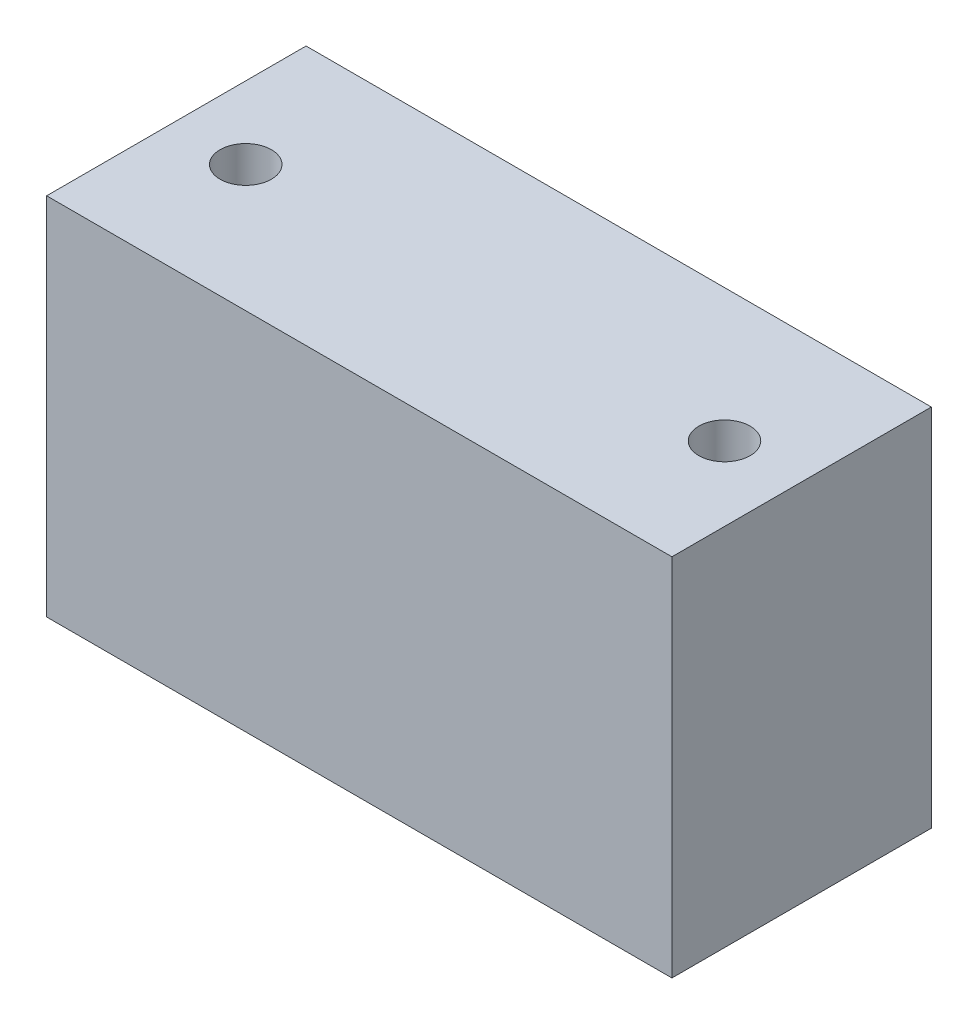
ISO-10303-21;
HEADER;
FILE_DESCRIPTION(('STEP AP214'),'2;1');
FILE_NAME('part.step','',(''),(''),'','','');
FILE_SCHEMA(('AUTOMOTIVE_DESIGN { 1 0 10303 214 1 1 1 1 }'));
ENDSEC;
DATA;
#1=APPLICATION_CONTEXT('core data for automotive mechanical design processes');
#2=APPLICATION_PROTOCOL_DEFINITION('international standard','automotive_design',2000,#1);
#3=PRODUCT_CONTEXT('',#1,'mechanical');
#4=PRODUCT('Part','Part','',(#3));
#5=PRODUCT_RELATED_PRODUCT_CATEGORY('part','',(#4));
#6=PRODUCT_DEFINITION_FORMATION('','',#4);
#7=PRODUCT_DEFINITION_CONTEXT('part definition',#1,'design');
#8=PRODUCT_DEFINITION('design','',#6,#7);
#9=PRODUCT_DEFINITION_SHAPE('','',#8);
#10=(LENGTH_UNIT() NAMED_UNIT(*) SI_UNIT(.MILLI.,.METRE.));
#11=(NAMED_UNIT(*) PLANE_ANGLE_UNIT() SI_UNIT($,.RADIAN.));
#12=(NAMED_UNIT(*) SI_UNIT($,.STERADIAN.) SOLID_ANGLE_UNIT());
#13=UNCERTAINTY_MEASURE_WITH_UNIT(LENGTH_MEASURE(1.E-05),#10,'distance_accuracy_value','');
#14=(GEOMETRIC_REPRESENTATION_CONTEXT(3) GLOBAL_UNCERTAINTY_ASSIGNED_CONTEXT((#13)) GLOBAL_UNIT_ASSIGNED_CONTEXT((#10,
#11,#12)) REPRESENTATION_CONTEXT('',''));
#15=CARTESIAN_POINT('',(0.,0.,0.));
#16=DIRECTION('',(0.,0.,1.));
#17=DIRECTION('',(1.,0.,0.));
#18=AXIS2_PLACEMENT_3D('',#15,#16,#17);
#19=CARTESIAN_POINT('',(17.4953052909621,32.,3.35378802988228));
#20=DIRECTION('',(1.,0.,0.));
#21=DIRECTION('',(0.,0.,-1.));
#22=AXIS2_PLACEMENT_3D('',#19,#20,#21);
#23=PLANE('',#22);
#24=DIRECTION('',(0.,0.,1.));
#25=VECTOR('',#24,1.);
#26=CARTESIAN_POINT('',(17.4953052909621,0.,3.35378802988228));
#27=LINE('',#26,#25);
#28=CARTESIAN_POINT('',(17.4953052909621,0.,-19.4050297637767));
#29=VERTEX_POINT('',#28);
#30=CARTESIAN_POINT('',(17.4953052909621,0.,3.35378802988228));
#31=VERTEX_POINT('',#30);
#32=EDGE_CURVE('E100',#29,#31,#27,.T.);
#33=ORIENTED_EDGE('',*,*,#32,.T.);
#34=DIRECTION('',(0.,-1.,0.));
#35=VECTOR('',#34,1.);
#36=CARTESIAN_POINT('',(17.4953052909621,32.,3.35378802988228));
#37=LINE('',#36,#35);
#38=CARTESIAN_POINT('',(17.4953052909621,32.,3.35378802988228));
#39=VERTEX_POINT('',#38);
#40=EDGE_CURVE('E11',#39,#31,#37,.T.);
#41=ORIENTED_EDGE('',*,*,#40,.F.);
#42=DIRECTION('',(0.,0.,1.));
#43=VECTOR('',#42,1.);
#44=CARTESIAN_POINT('',(17.4953052909621,32.,3.35378802988228));
#45=LINE('',#44,#43);
#46=CARTESIAN_POINT('',(17.4953052909621,32.,-19.4050297637767));
#47=VERTEX_POINT('',#46);
#48=EDGE_CURVE('E88',#47,#39,#45,.T.);
#49=ORIENTED_EDGE('',*,*,#48,.F.);
#50=DIRECTION('',(0.,-1.,0.));
#51=VECTOR('',#50,1.);
#52=CARTESIAN_POINT('',(17.4953052909621,32.,-19.4050297637767));
#53=LINE('',#52,#51);
#54=EDGE_CURVE('E96',#47,#29,#53,.T.);
#55=ORIENTED_EDGE('',*,*,#54,.T.);
#56=EDGE_LOOP('',(#33,#41,#49,#55));
#57=FACE_BOUND('',#56,.T.);
#58=ADVANCED_FACE('F37',(#57),#23,.F.);
#59=CARTESIAN_POINT('',(17.4953052909621,32.,3.35378802988228));
#60=DIRECTION('',(0.,0.,-1.));
#61=DIRECTION('',(-1.,0.,0.));
#62=AXIS2_PLACEMENT_3D('',#59,#60,#61);
#63=PLANE('',#62);
#64=DIRECTION('',(1.,0.,0.));
#65=VECTOR('',#64,1.);
#66=CARTESIAN_POINT('',(17.4953052909621,0.,3.35378802988228));
#67=LINE('',#66,#65);
#68=CARTESIAN_POINT('',(72.3483949693422,0.,3.35378802988228));
#69=VERTEX_POINT('',#68);
#70=EDGE_CURVE('E92',#31,#69,#67,.T.);
#71=ORIENTED_EDGE('',*,*,#70,.T.);
#72=DIRECTION('',(0.,-1.,0.));
#73=VECTOR('',#72,1.);
#74=CARTESIAN_POINT('',(72.3483949693422,32.,3.35378802988228));
#75=LINE('',#74,#73);
#76=CARTESIAN_POINT('',(72.3483949693422,32.,3.35378802988228));
#77=VERTEX_POINT('',#76);
#78=EDGE_CURVE('E45',#77,#69,#75,.T.);
#79=ORIENTED_EDGE('',*,*,#78,.F.);
#80=DIRECTION('',(1.,0.,0.));
#81=VECTOR('',#80,1.);
#82=CARTESIAN_POINT('',(17.4953052909621,32.,3.35378802988228));
#83=LINE('',#82,#81);
#84=EDGE_CURVE('E83',#39,#77,#83,.T.);
#85=ORIENTED_EDGE('',*,*,#84,.F.);
#86=ORIENTED_EDGE('',*,*,#40,.T.);
#87=EDGE_LOOP('',(#71,#79,#85,#86));
#88=FACE_BOUND('',#87,.T.);
#89=ADVANCED_FACE('F91',(#88),#63,.F.);
#90=CARTESIAN_POINT('',(72.3483949693422,32.,3.35378802988228));
#91=DIRECTION('',(-1.,0.,0.));
#92=DIRECTION('',(0.,0.,1.));
#93=AXIS2_PLACEMENT_3D('',#90,#91,#92);
#94=PLANE('',#93);
#95=DIRECTION('',(0.,0.,-1.));
#96=VECTOR('',#95,1.);
#97=CARTESIAN_POINT('',(72.3483949693422,0.,3.35378802988228));
#98=LINE('',#97,#96);
#99=CARTESIAN_POINT('',(72.3483949693422,0.,-19.4050297637767));
#100=VERTEX_POINT('',#99);
#101=EDGE_CURVE('E70',#69,#100,#98,.T.);
#102=ORIENTED_EDGE('',*,*,#101,.T.);
#103=DIRECTION('',(0.,-1.,0.));
#104=VECTOR('',#103,1.);
#105=CARTESIAN_POINT('',(72.3483949693422,32.,-19.4050297637767));
#106=LINE('',#105,#104);
#107=CARTESIAN_POINT('',(72.3483949693422,32.,-19.4050297637767));
#108=VERTEX_POINT('',#107);
#109=EDGE_CURVE('E93',#108,#100,#106,.T.);
#110=ORIENTED_EDGE('',*,*,#109,.F.);
#111=DIRECTION('',(0.,0.,-1.));
#112=VECTOR('',#111,1.);
#113=CARTESIAN_POINT('',(72.3483949693422,32.,3.35378802988228));
#114=LINE('',#113,#112);
#115=EDGE_CURVE('E86',#77,#108,#114,.T.);
#116=ORIENTED_EDGE('',*,*,#115,.F.);
#117=ORIENTED_EDGE('',*,*,#78,.T.);
#118=EDGE_LOOP('',(#102,#110,#116,#117));
#119=FACE_BOUND('',#118,.T.);
#120=ADVANCED_FACE('F94',(#119),#94,.F.);
#121=CARTESIAN_POINT('',(17.4953052909621,32.,-19.4050297637767));
#122=DIRECTION('',(0.,0.,1.));
#123=DIRECTION('',(1.,0.,0.));
#124=AXIS2_PLACEMENT_3D('',#121,#122,#123);
#125=PLANE('',#124);
#126=DIRECTION('',(-1.,0.,0.));
#127=VECTOR('',#126,1.);
#128=CARTESIAN_POINT('',(17.4953052909621,0.,-19.4050297637767));
#129=LINE('',#128,#127);
#130=EDGE_CURVE('E76',#100,#29,#129,.T.);
#131=ORIENTED_EDGE('',*,*,#130,.T.);
#132=ORIENTED_EDGE('',*,*,#54,.F.);
#133=DIRECTION('',(-1.,0.,0.));
#134=VECTOR('',#133,1.);
#135=CARTESIAN_POINT('',(17.4953052909621,32.,-19.4050297637767));
#136=LINE('',#135,#134);
#137=EDGE_CURVE('E53',#108,#47,#136,.T.);
#138=ORIENTED_EDGE('',*,*,#137,.F.);
#139=ORIENTED_EDGE('',*,*,#109,.T.);
#140=EDGE_LOOP('',(#131,#132,#138,#139));
#141=FACE_BOUND('',#140,.T.);
#142=ADVANCED_FACE('F108',(#141),#125,.F.);
#143=CARTESIAN_POINT('',(0.,32.,0.));
#144=DIRECTION('',(0.,-1.,0.));
#145=DIRECTION('',(0.,0.,-1.));
#146=AXIS2_PLACEMENT_3D('',#143,#144,#145);
#147=PLANE('',#146);
#148=CARTESIAN_POINT('',(23.8483949693357,32.,-7.7574195805578));
#149=DIRECTION('',(0.,1.,0.));
#150=DIRECTION('',(0.,0.,1.));
#151=AXIS2_PLACEMENT_3D('',#148,#149,#150);
#152=CIRCLE('',#151,2.25);
#153=CARTESIAN_POINT('',(23.8483949693357,32.,-5.5074195805578));
#154=VERTEX_POINT('',#153);
#155=EDGE_CURVE('E120',#154,#154,#152,.T.);
#156=ORIENTED_EDGE('',*,*,#155,.F.);
#157=EDGE_LOOP('',(#156));
#158=FACE_BOUND('',#157,.T.);
#159=CARTESIAN_POINT('',(65.8483949693357,32.,-7.7574195805578));
#160=DIRECTION('',(0.,1.,0.));
#161=DIRECTION('',(0.,0.,1.));
#162=AXIS2_PLACEMENT_3D('',#159,#160,#161);
#163=CIRCLE('',#162,2.24999999999998);
#164=CARTESIAN_POINT('',(65.8483949693357,32.,-5.50741958055782));
#165=VERTEX_POINT('',#164);
#166=EDGE_CURVE('E117',#165,#165,#163,.T.);
#167=ORIENTED_EDGE('',*,*,#166,.F.);
#168=EDGE_LOOP('',(#167));
#169=FACE_BOUND('',#168,.T.);
#170=ORIENTED_EDGE('',*,*,#48,.T.);
#171=ORIENTED_EDGE('',*,*,#84,.T.);
#172=ORIENTED_EDGE('',*,*,#115,.T.);
#173=ORIENTED_EDGE('',*,*,#137,.T.);
#174=EDGE_LOOP('',(#170,#171,#172,#173));
#175=FACE_BOUND('',#174,.T.);
#176=ADVANCED_FACE('F84',(#158,#169,#175),#147,.F.);
#177=CARTESIAN_POINT('',(0.,0.,0.));
#178=DIRECTION('',(0.,-1.,0.));
#179=DIRECTION('',(0.,0.,-1.));
#180=AXIS2_PLACEMENT_3D('',#177,#178,#179);
#181=PLANE('',#180);
#182=CARTESIAN_POINT('',(23.8483949693357,0.,-7.7574195805578));
#183=DIRECTION('',(0.,1.,0.));
#184=DIRECTION('',(0.,0.,1.));
#185=AXIS2_PLACEMENT_3D('',#182,#183,#184);
#186=CIRCLE('',#185,2.25);
#187=CARTESIAN_POINT('',(23.8483949693357,0.,-5.5074195805578));
#188=VERTEX_POINT('',#187);
#189=EDGE_CURVE('E103',#188,#188,#186,.T.);
#190=ORIENTED_EDGE('',*,*,#189,.T.);
#191=EDGE_LOOP('',(#190));
#192=FACE_BOUND('',#191,.T.);
#193=CARTESIAN_POINT('',(65.8483949693357,0.,-7.7574195805578));
#194=DIRECTION('',(0.,1.,0.));
#195=DIRECTION('',(0.,0.,1.));
#196=AXIS2_PLACEMENT_3D('',#193,#194,#195);
#197=CIRCLE('',#196,2.24999999999998);
#198=CARTESIAN_POINT('',(65.8483949693357,0.,-5.50741958055782));
#199=VERTEX_POINT('',#198);
#200=EDGE_CURVE('E114',#199,#199,#197,.T.);
#201=ORIENTED_EDGE('',*,*,#200,.T.);
#202=EDGE_LOOP('',(#201));
#203=FACE_BOUND('',#202,.T.);
#204=ORIENTED_EDGE('',*,*,#32,.F.);
#205=ORIENTED_EDGE('',*,*,#130,.F.);
#206=ORIENTED_EDGE('',*,*,#101,.F.);
#207=ORIENTED_EDGE('',*,*,#70,.F.);
#208=EDGE_LOOP('',(#204,#205,#206,#207));
#209=FACE_BOUND('',#208,.T.);
#210=ADVANCED_FACE('F111',(#192,#203,#209),#181,.T.);
#211=CARTESIAN_POINT('',(65.8483949693357,0.,-7.7574195805578));
#212=DIRECTION('',(0.,1.,0.));
#213=DIRECTION('',(0.,0.,1.));
#214=AXIS2_PLACEMENT_3D('',#211,#212,#213);
#215=CYLINDRICAL_SURFACE('',#214,2.24999999999998);
#216=ORIENTED_EDGE('',*,*,#200,.F.);
#217=EDGE_LOOP('',(#216));
#218=FACE_BOUND('',#217,.T.);
#219=ORIENTED_EDGE('',*,*,#166,.T.);
#220=EDGE_LOOP('',(#219));
#221=FACE_BOUND('',#220,.T.);
#222=ADVANCED_FACE('F131',(#218,#221),#215,.F.);
#223=CARTESIAN_POINT('',(23.8483949693357,0.,-7.7574195805578));
#224=DIRECTION('',(0.,1.,0.));
#225=DIRECTION('',(0.,0.,1.));
#226=AXIS2_PLACEMENT_3D('',#223,#224,#225);
#227=CYLINDRICAL_SURFACE('',#226,2.25);
#228=ORIENTED_EDGE('',*,*,#189,.F.);
#229=EDGE_LOOP('',(#228));
#230=FACE_BOUND('',#229,.T.);
#231=ORIENTED_EDGE('',*,*,#155,.T.);
#232=EDGE_LOOP('',(#231));
#233=FACE_BOUND('',#232,.T.);
#234=ADVANCED_FACE('F128',(#230,#233),#227,.F.);
#235=CLOSED_SHELL('',(#58,#89,#120,#142,#176,#210,#222,#234));
#236=MANIFOLD_SOLID_BREP('B2',#235);
#237=ADVANCED_BREP_SHAPE_REPRESENTATION('',(#18,#236),#14);
#238=SHAPE_DEFINITION_REPRESENTATION(#9,#237);
ENDSEC;
END-ISO-10303-21;
